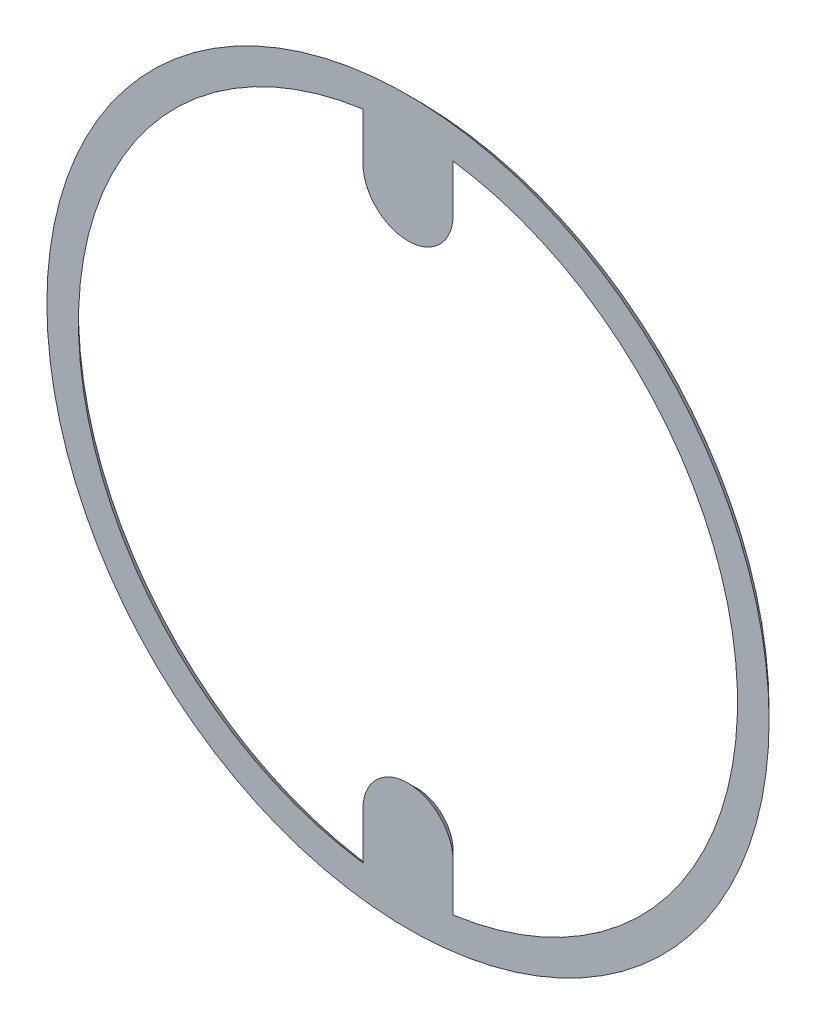
ISO-10303-21;
HEADER;
FILE_DESCRIPTION(('STEP AP214'),'2;1');
FILE_NAME('part.step','',(''),(''),'','','');
FILE_SCHEMA(('AUTOMOTIVE_DESIGN { 1 0 10303 214 1 1 1 1 }'));
ENDSEC;
DATA;
#1=APPLICATION_CONTEXT('core data for automotive mechanical design processes');
#2=APPLICATION_PROTOCOL_DEFINITION('international standard','automotive_design',2000,#1);
#3=PRODUCT_CONTEXT('',#1,'mechanical');
#4=PRODUCT('Part','Part','',(#3));
#5=PRODUCT_RELATED_PRODUCT_CATEGORY('part','',(#4));
#6=PRODUCT_DEFINITION_FORMATION('','',#4);
#7=PRODUCT_DEFINITION_CONTEXT('part definition',#1,'design');
#8=PRODUCT_DEFINITION('design','',#6,#7);
#9=PRODUCT_DEFINITION_SHAPE('','',#8);
#10=(LENGTH_UNIT() NAMED_UNIT(*) SI_UNIT(.MILLI.,.METRE.));
#11=(NAMED_UNIT(*) PLANE_ANGLE_UNIT() SI_UNIT($,.RADIAN.));
#12=(NAMED_UNIT(*) SI_UNIT($,.STERADIAN.) SOLID_ANGLE_UNIT());
#13=UNCERTAINTY_MEASURE_WITH_UNIT(LENGTH_MEASURE(1.E-05),#10,'distance_accuracy_value','');
#14=(GEOMETRIC_REPRESENTATION_CONTEXT(3) GLOBAL_UNCERTAINTY_ASSIGNED_CONTEXT((#13)) GLOBAL_UNIT_ASSIGNED_CONTEXT((#10,
#11,#12)) REPRESENTATION_CONTEXT('',''));
#15=CARTESIAN_POINT('',(0.,0.,0.));
#16=DIRECTION('',(0.,0.,1.));
#17=DIRECTION('',(1.,0.,0.));
#18=AXIS2_PLACEMENT_3D('',#15,#16,#17);
#19=CARTESIAN_POINT('',(56.000092772734,78.000046376367,3.699999952316));
#20=DIRECTION('',(0.,0.,-1.));
#21=DIRECTION('',(-1.,0.,0.));
#22=AXIS2_PLACEMENT_3D('',#19,#20,#21);
#23=PLANE('',#22);
#24=CARTESIAN_POINT('',(56.000092772734,78.000046376367,3.69999995228909));
#25=DIRECTION('',(0.,0.,1.));
#26=DIRECTION('',(1.,0.,0.));
#27=AXIS2_PLACEMENT_3D('',#24,#25,#26);
#28=CIRCLE('',#27,3.89999999993758);
#29=CARTESIAN_POINT('',(59.9000927726716,78.000046376367,3.69999995228909));
#30=VERTEX_POINT('',#29);
#31=EDGE_CURVE('E107',#30,#30,#28,.T.);
#32=ORIENTED_EDGE('',*,*,#31,.F.);
#33=EDGE_LOOP('',(#32));
#34=FACE_BOUND('',#33,.T.);
#35=CARTESIAN_POINT('',(56.000092772734,78.000046376367,3.69999995228908));
#36=DIRECTION('',(0.,0.,-1.));
#37=DIRECTION('',(-1.,0.,0.));
#38=AXIS2_PLACEMENT_3D('',#35,#36,#37);
#39=CIRCLE('',#38,3.75000000003208);
#40=CARTESIAN_POINT('',(56.4000928171839,74.2714407436192,3.69999995230275));
#41=VERTEX_POINT('',#40);
#42=CARTESIAN_POINT('',(56.4000927301314,81.7286520165374,3.69999995417658));
#43=VERTEX_POINT('',#42);
#44=EDGE_CURVE('E127',#41,#43,#39,.F.);
#45=ORIENTED_EDGE('',*,*,#44,.T.);
#46=DIRECTION('',(-5.96244031924794E-09,1.,5.96244031924794E-09));
#47=VECTOR('',#46,1.);
#48=CARTESIAN_POINT('',(56.4000927542505,78.00004638233,3.69999993383249));
#49=LINE('',#48,#47);
#50=CARTESIAN_POINT('',(56.4000927357452,81.1000463799445,3.69999995228909));
#51=VERTEX_POINT('',#50);
#52=EDGE_CURVE('E125',#51,#43,#49,.T.);
#53=ORIENTED_EDGE('',*,*,#52,.F.);
#54=CARTESIAN_POINT('',(56.000092735767,81.100046376367,3.69999995228909));
#55=DIRECTION('',(0.,0.,1.));
#56=DIRECTION('',(1.,0.,0.));
#57=AXIS2_PLACEMENT_3D('',#54,#55,#56);
#58=CIRCLE('',#57,0.39999999994586);
#59=CARTESIAN_POINT('',(55.6000927339082,81.1000463715974,3.69999995418493));
#60=VERTEX_POINT('',#59);
#61=EDGE_CURVE('E115',#60,#51,#58,.T.);
#62=ORIENTED_EDGE('',*,*,#61,.F.);
#63=DIRECTION('',(-5.96244031924794E-09,1.,-5.96244031924794E-09));
#64=VECTOR('',#63,1.);
#65=CARTESIAN_POINT('',(55.6000927505025,78.000046370405,3.6999999745475));
#66=LINE('',#65,#64);
#67=CARTESIAN_POINT('',(55.6000927282843,81.7286520091153,3.6999999523025));
#68=VERTEX_POINT('',#67);
#69=EDGE_CURVE('E93',#68,#60,#66,.F.);
#70=ORIENTED_EDGE('',*,*,#69,.F.);
#71=CARTESIAN_POINT('',(56.000092772734,78.000046376367,3.69999995228909));
#72=DIRECTION('',(0.,0.,-1.));
#73=DIRECTION('',(-1.,0.,0.));
#74=AXIS2_PLACEMENT_3D('',#71,#72,#73);
#75=CIRCLE('',#74,3.75000000003207);
#76=CARTESIAN_POINT('',(55.6000928153368,74.2714407361971,3.69999995417634));
#77=VERTEX_POINT('',#76);
#78=EDGE_CURVE('E90',#68,#77,#75,.F.);
#79=ORIENTED_EDGE('',*,*,#78,.T.);
#80=DIRECTION('',(-5.96244031924794E-09,1.,-5.96244031924794E-09));
#81=VECTOR('',#80,1.);
#82=CARTESIAN_POINT('',(55.600092791218,78.000046370405,3.699999933832));
#83=LINE('',#82,#81);
#84=CARTESIAN_POINT('',(55.6000928097148,74.9000463727895,3.6999999522815));
#85=VERTEX_POINT('',#84);
#86=EDGE_CURVE('E130',#85,#77,#83,.F.);
#87=ORIENTED_EDGE('',*,*,#86,.F.);
#88=CARTESIAN_POINT('',(56.000092809702,74.900046376367,3.69999995228909));
#89=DIRECTION('',(0.,0.,1.));
#90=DIRECTION('',(1.,0.,0.));
#91=AXIS2_PLACEMENT_3D('',#88,#89,#90);
#92=CIRCLE('',#91,0.399999999981152);
#93=CARTESIAN_POINT('',(56.4000928115619,74.900046381137,3.69999995417676));
#94=VERTEX_POINT('',#93);
#95=EDGE_CURVE('E124',#94,#85,#92,.T.);
#96=ORIENTED_EDGE('',*,*,#95,.F.);
#97=DIRECTION('',(-5.96244031924794E-09,1.,5.96244031924794E-09));
#98=VECTOR('',#97,1.);
#99=CARTESIAN_POINT('',(56.400092794966,78.00004638233,3.699999974548));
#100=LINE('',#99,#98);
#101=EDGE_CURVE('E121',#41,#94,#100,.T.);
#102=ORIENTED_EDGE('',*,*,#101,.F.);
#103=EDGE_LOOP('',(#45,#53,#62,#70,#79,#87,#96,#102));
#104=FACE_BOUND('',#103,.T.);
#105=ADVANCED_FACE('F17',(#34,#104),#23,.T.);
#106=CARTESIAN_POINT('',(55.500092772734,78.000046370405,3.799999952316));
#107=DIRECTION('',(-0.707106781186548,-8.4321639643206E-09,-0.707106781186547));
#108=DIRECTION('',(-0.707106781186547,0.,0.707106781186548));
#109=AXIS2_PLACEMENT_3D('',#106,#107,#108);
#110=PLANE('',#109);
#111=ORIENTED_EDGE('',*,*,#69,.T.);
#112=DIRECTION('',(0.707106781186231,8.4315532254713E-09,-0.707106781186864));
#113=VECTOR('',#112,1.);
#114=CARTESIAN_POINT('',(-498940.699906865,81.0940963312715,499000.));
#115=LINE('',#114,#113);
#116=CARTESIAN_POINT('',(55.5000927357729,81.100046373386,3.79999995232083));
#117=VERTEX_POINT('',#116);
#118=EDGE_CURVE('E106',#117,#60,#115,.T.);
#119=ORIENTED_EDGE('',*,*,#118,.F.);
#120=DIRECTION('',(0.,1.,0.));
#121=VECTOR('',#120,1.);
#122=CARTESIAN_POINT('',(55.500092735767,78.000046376367,3.799999952316));
#123=LINE('',#122,#121);
#124=CARTESIAN_POINT('',(55.5000927326915,81.6156376087893,3.79999995231962));
#125=VERTEX_POINT('',#124);
#126=EDGE_CURVE('E98',#117,#125,#123,.T.);
#127=ORIENTED_EDGE('',*,*,#126,.T.);
#128=CARTESIAN_POINT('',(55.5000927296161,81.6156376083652,3.79999995231841));
#129=CARTESIAN_POINT('',(55.5166594475783,81.6346502284434,3.78343323412953));
#130=CARTESIAN_POINT('',(55.5332761413765,81.6535744069867,3.76681654010558));
#131=CARTESIAN_POINT('',(55.5666094743026,81.6912458738354,3.73348320673031));
#132=CARTESIAN_POINT('',(55.5833261133923,81.709993162208,3.71676656741703));
#133=CARTESIAN_POINT('',(55.6000927282801,81.728652009113,3.69999995230672));
#134=B_SPLINE_CURVE_WITH_KNOTS('',3,(#128,#129,#130,#131,#132,#133),.UNSPECIFIED.,.F.,.F.,(4,2,
4),(0.,0.0905161979951703,0.181032361542956),.UNSPECIFIED.);
#135=EDGE_CURVE('E20',#125,#68,#134,.T.);
#136=ORIENTED_EDGE('',*,*,#135,.T.);
#137=EDGE_LOOP('',(#111,#119,#127,#136));
#138=FACE_BOUND('',#137,.T.);
#139=ADVANCED_FACE('F104',(#138),#110,.T.);
#140=CARTESIAN_POINT('',(56.000092772734,78.000046376367,3.69999995240278));
#141=DIRECTION('',(0.,0.,-1.));
#142=DIRECTION('',(-1.,0.,0.));
#143=AXIS2_PLACEMENT_3D('',#140,#141,#142);
#144=CONICAL_SURFACE('',#143,3.74999999991839,0.785398163397448);
#145=CARTESIAN_POINT('',(55.6000928147935,74.2714407367667,3.69999995471964));
#146=CARTESIAN_POINT('',(55.5833261998676,74.2900995828326,3.71676656942304));
#147=CARTESIAN_POINT('',(55.5666095607354,74.308846870363,3.73348320833176));
#148=CARTESIAN_POINT('',(55.5332762277153,74.3465183355214,3.76681654090262));
#149=CARTESIAN_POINT('',(55.5166595338655,74.3654425132165,3.78343323452672));
#150=CARTESIAN_POINT('',(55.5000928158474,74.3844551324436,3.7999999523181));
#151=B_SPLINE_CURVE_WITH_KNOTS('',3,(#145,#146,#147,#148,#149,#150),.UNSPECIFIED.,.F.,.F.,(4,2,
4),(0.,0.090516161376299,0.181032357199962),.UNSPECIFIED.);
#152=CARTESIAN_POINT('',(55.5000928158487,74.3844551324448,3.79999995231947));
#153=VERTEX_POINT('',#152);
#154=EDGE_CURVE('E131',#77,#153,#151,.T.);
#155=ORIENTED_EDGE('',*,*,#154,.F.);
#156=ORIENTED_EDGE('',*,*,#78,.F.);
#157=ORIENTED_EDGE('',*,*,#135,.F.);
#158=CARTESIAN_POINT('',(56.000092772734,78.000046376367,3.79999995232084));
#159=DIRECTION('',(0.,0.,-1.));
#160=DIRECTION('',(-1.,0.,0.));
#161=AXIS2_PLACEMENT_3D('',#158,#159,#160);
#162=CIRCLE('',#161,3.65000000000033);
#163=EDGE_CURVE('E88',#125,#153,#162,.F.);
#164=ORIENTED_EDGE('',*,*,#163,.T.);
#165=EDGE_LOOP('',(#155,#156,#157,#164));
#166=FACE_BOUND('',#165,.T.);
#167=ADVANCED_FACE('F87',(#166),#144,.F.);
#168=CARTESIAN_POINT('',(55.500092772734,78.000046370405,3.799999952316));
#169=DIRECTION('',(-0.707106781186548,-8.4321639643206E-09,-0.707106781186547));
#170=DIRECTION('',(-0.707106781186547,0.,0.707106781186548));
#171=AXIS2_PLACEMENT_3D('',#168,#169,#170);
#172=PLANE('',#171);
#173=ORIENTED_EDGE('',*,*,#86,.T.);
#174=ORIENTED_EDGE('',*,*,#154,.T.);
#175=DIRECTION('',(0.,1.,0.));
#176=VECTOR('',#175,1.);
#177=CARTESIAN_POINT('',(55.50009281585,78.000046376367,3.799999952316));
#178=LINE('',#177,#176);
#179=CARTESIAN_POINT('',(55.5000928127251,74.9000463733857,3.79999995235296));
#180=VERTEX_POINT('',#179);
#181=EDGE_CURVE('E102',#153,#180,#178,.T.);
#182=ORIENTED_EDGE('',*,*,#181,.T.);
#183=DIRECTION('',(0.707106781186231,8.43224783437502E-09,-0.707106781186864));
#184=VECTOR('',#183,1.);
#185=CARTESIAN_POINT('',(-498940.699906791,74.8940958410944,499000.));
#186=LINE('',#185,#184);
#187=EDGE_CURVE('E122',#85,#180,#186,.F.);
#188=ORIENTED_EDGE('',*,*,#187,.F.);
#189=EDGE_LOOP('',(#173,#174,#182,#188));
#190=FACE_BOUND('',#189,.T.);
#191=ADVANCED_FACE('F175',(#190),#172,.T.);
#192=CARTESIAN_POINT('',(56.000092809702,74.900046376367,3.79999995232083));
#193=DIRECTION('',(0.,0.,1.));
#194=DIRECTION('',(1.,0.,0.));
#195=AXIS2_PLACEMENT_3D('',#192,#193,#194);
#196=CONICAL_SURFACE('',#195,0.500000000012893,0.785398163397448);
#197=ORIENTED_EDGE('',*,*,#95,.T.);
#198=ORIENTED_EDGE('',*,*,#187,.T.);
#199=CARTESIAN_POINT('',(56.000092809702,74.900046376367,3.79999995235296));
#200=DIRECTION('',(0.,0.,1.));
#201=DIRECTION('',(1.,0.,0.));
#202=AXIS2_PLACEMENT_3D('',#199,#200,#201);
#203=CIRCLE('',#202,0.50000000004502);
#204=CARTESIAN_POINT('',(56.5000928097019,74.900046378752,3.79999995233459));
#205=VERTEX_POINT('',#204);
#206=EDGE_CURVE('E139',#180,#205,#203,.F.);
#207=ORIENTED_EDGE('',*,*,#206,.T.);
#208=DIRECTION('',(-0.707106781186547,0.,-0.707106781186548));
#209=VECTOR('',#208,1.);
#210=CARTESIAN_POINT('',(56.5000927912176,74.900046381137,3.79999993383244));
#211=LINE('',#210,#209);
#212=EDGE_CURVE('E118',#94,#205,#211,.F.);
#213=ORIENTED_EDGE('',*,*,#212,.F.);
#214=EDGE_LOOP('',(#197,#198,#207,#213));
#215=FACE_BOUND('',#214,.T.);
#216=ADVANCED_FACE('F218',(#215),#196,.T.);
#217=CARTESIAN_POINT('',(56.500092772734,78.00004638233,3.799999952316));
#218=DIRECTION('',(0.707106781186548,8.4321639643206E-09,-0.707106781186547));
#219=DIRECTION('',(-0.707106781186547,0.,-0.707106781186548));
#220=AXIS2_PLACEMENT_3D('',#217,#218,#219);
#221=PLANE('',#220);
#222=ORIENTED_EDGE('',*,*,#101,.T.);
#223=ORIENTED_EDGE('',*,*,#212,.T.);
#224=DIRECTION('',(0.,1.,0.));
#225=VECTOR('',#224,1.);
#226=CARTESIAN_POINT('',(56.500092809702,78.000046376367,3.799999952316));
#227=LINE('',#226,#225);
#228=CARTESIAN_POINT('',(56.5000928127771,74.384455143945,3.79999995231979));
#229=VERTEX_POINT('',#228);
#230=EDGE_CURVE('E138',#205,#229,#227,.F.);
#231=ORIENTED_EDGE('',*,*,#230,.T.);
#232=CARTESIAN_POINT('',(56.5000928158522,74.3844551443692,3.79999995231875));
#233=CARTESIAN_POINT('',(56.4835260978901,74.365442524291,3.78343323412989));
#234=CARTESIAN_POINT('',(56.4669094040919,74.3465183457477,3.76681654010597));
#235=CARTESIAN_POINT('',(56.4335760711659,74.3088468788991,3.73348320673075));
#236=CARTESIAN_POINT('',(56.4168594320762,74.2900995905265,3.71676656741749));
#237=CARTESIAN_POINT('',(56.4000928171884,74.2714407436215,3.69999995230721));
#238=B_SPLINE_CURVE_WITH_KNOTS('',3,(#232,#233,#234,#235,#236,#237),.UNSPECIFIED.,.F.,.F.,(4,2,
4),(0.,0.0905161979950283,0.181032361542683),.UNSPECIFIED.);
#239=EDGE_CURVE('E120',#229,#41,#238,.T.);
#240=ORIENTED_EDGE('',*,*,#239,.T.);
#241=EDGE_LOOP('',(#222,#223,#231,#240));
#242=FACE_BOUND('',#241,.T.);
#243=ADVANCED_FACE('F158',(#242),#221,.T.);
#244=CARTESIAN_POINT('',(56.000092772734,78.000046376367,3.69999995240278));
#245=DIRECTION('',(0.,0.,-1.));
#246=DIRECTION('',(-1.,0.,0.));
#247=AXIS2_PLACEMENT_3D('',#244,#245,#246);
#248=CONICAL_SURFACE('',#247,3.74999999991839,0.785398163397448);
#249=CARTESIAN_POINT('',(56.4000927306745,81.7286520159673,3.69999995471964));
#250=CARTESIAN_POINT('',(56.4168593456004,81.7099931699014,3.71676656942304));
#251=CARTESIAN_POINT('',(56.4335759847327,81.6912458823709,3.73348320833177));
#252=CARTESIAN_POINT('',(56.4669093177528,81.6535744172126,3.76681654090263));
#253=CARTESIAN_POINT('',(56.4835260116025,81.6346502395175,3.78343323452673));
#254=CARTESIAN_POINT('',(56.5000927296206,81.6156376202904,3.79999995231812));
#255=B_SPLINE_CURVE_WITH_KNOTS('',3,(#249,#250,#251,#252,#253,#254),.UNSPECIFIED.,.F.,.F.,(4,2,
4),(0.,0.0905161613762983,0.181032357199986),.UNSPECIFIED.);
#256=CARTESIAN_POINT('',(56.5000927296198,81.6156376202891,3.79999995231947));
#257=VERTEX_POINT('',#256);
#258=EDGE_CURVE('E117',#43,#257,#255,.T.);
#259=ORIENTED_EDGE('',*,*,#258,.F.);
#260=ORIENTED_EDGE('',*,*,#44,.F.);
#261=ORIENTED_EDGE('',*,*,#239,.F.);
#262=CARTESIAN_POINT('',(56.000092772734,78.000046376367,3.79999995232083));
#263=DIRECTION('',(0.,0.,-1.));
#264=DIRECTION('',(-1.,0.,0.));
#265=AXIS2_PLACEMENT_3D('',#262,#263,#264);
#266=CIRCLE('',#265,3.65000000000034);
#267=EDGE_CURVE('E135',#229,#257,#266,.F.);
#268=ORIENTED_EDGE('',*,*,#267,.T.);
#269=EDGE_LOOP('',(#259,#260,#261,#268));
#270=FACE_BOUND('',#269,.T.);
#271=ADVANCED_FACE('F154',(#270),#248,.F.);
#272=CARTESIAN_POINT('',(56.500092772734,78.00004638233,3.799999952316));
#273=DIRECTION('',(0.707106781186548,8.4321639643206E-09,-0.707106781186547));
#274=DIRECTION('',(-0.707106781186547,0.,-0.707106781186548));
#275=AXIS2_PLACEMENT_3D('',#272,#273,#274);
#276=PLANE('',#275);
#277=ORIENTED_EDGE('',*,*,#52,.T.);
#278=ORIENTED_EDGE('',*,*,#258,.T.);
#279=DIRECTION('',(0.,1.,0.));
#280=VECTOR('',#279,1.);
#281=CARTESIAN_POINT('',(56.500092729619,78.000046376367,3.799999952316));
#282=LINE('',#281,#280);
#283=CARTESIAN_POINT('',(56.5000927326871,81.1000463793483,3.79999995232083));
#284=VERTEX_POINT('',#283);
#285=EDGE_CURVE('E134',#257,#284,#282,.F.);
#286=ORIENTED_EDGE('',*,*,#285,.T.);
#287=DIRECTION('',(-0.707106781186231,-8.43224776396138E-09,-0.707106781186864));
#288=VECTOR('',#287,1.);
#289=CARTESIAN_POINT('',(499052.700092336,81.1059969115899,499000.));
#290=LINE('',#289,#288);
#291=EDGE_CURVE('E40',#51,#284,#290,.F.);
#292=ORIENTED_EDGE('',*,*,#291,.F.);
#293=EDGE_LOOP('',(#277,#278,#286,#292));
#294=FACE_BOUND('',#293,.T.);
#295=ADVANCED_FACE('F151',(#294),#276,.T.);
#296=CARTESIAN_POINT('',(56.000092735767,81.100046376367,3.79999995232083));
#297=DIRECTION('',(0.,0.,1.));
#298=DIRECTION('',(1.,0.,0.));
#299=AXIS2_PLACEMENT_3D('',#296,#297,#298);
#300=CONICAL_SURFACE('',#299,0.499999999977602,0.785398163397448);
#301=ORIENTED_EDGE('',*,*,#61,.T.);
#302=ORIENTED_EDGE('',*,*,#291,.T.);
#303=CARTESIAN_POINT('',(56.000092735767,81.100046376367,3.79999995232083));
#304=DIRECTION('',(0.,0.,1.));
#305=DIRECTION('',(1.,0.,0.));
#306=AXIS2_PLACEMENT_3D('',#303,#304,#305);
#307=CIRCLE('',#306,0.499999999977602);
#308=EDGE_CURVE('E31',#284,#117,#307,.F.);
#309=ORIENTED_EDGE('',*,*,#308,.T.);
#310=ORIENTED_EDGE('',*,*,#118,.T.);
#311=EDGE_LOOP('',(#301,#302,#309,#310));
#312=FACE_BOUND('',#311,.T.);
#313=ADVANCED_FACE('F194',(#312),#300,.T.);
#314=CARTESIAN_POINT('',(56.000092772734,78.000046376367,3.79999995226399));
#315=DIRECTION('',(0.,0.,1.));
#316=DIRECTION('',(1.,0.,0.));
#317=AXIS2_PLACEMENT_3D('',#314,#315,#316);
#318=CONICAL_SURFACE('',#317,3.99999999991248,0.78539816339745);
#319=CARTESIAN_POINT('',(56.000092772734,78.000046376367,3.79999995231377));
#320=DIRECTION('',(0.,0.,1.));
#321=DIRECTION('',(1.,0.,0.));
#322=AXIS2_PLACEMENT_3D('',#319,#320,#321);
#323=CIRCLE('',#322,3.99999999996226);
#324=CARTESIAN_POINT('',(60.0000927726963,78.000046376367,3.79999995231377));
#325=VERTEX_POINT('',#324);
#326=EDGE_CURVE('E11',#325,#325,#323,.F.);
#327=ORIENTED_EDGE('',*,*,#326,.T.);
#328=EDGE_LOOP('',(#327));
#329=FACE_BOUND('',#328,.T.);
#330=ORIENTED_EDGE('',*,*,#31,.T.);
#331=EDGE_LOOP('',(#330));
#332=FACE_BOUND('',#331,.T.);
#333=ADVANCED_FACE('F188',(#329,#332),#318,.T.);
#334=CARTESIAN_POINT('',(56.000092772734,78.000046376367,3.799999952316));
#335=DIRECTION('',(0.,0.,-1.));
#336=DIRECTION('',(-1.,0.,0.));
#337=AXIS2_PLACEMENT_3D('',#334,#335,#336);
#338=PLANE('',#337);
#339=ORIENTED_EDGE('',*,*,#326,.F.);
#340=EDGE_LOOP('',(#339));
#341=FACE_BOUND('',#340,.T.);
#342=ORIENTED_EDGE('',*,*,#285,.F.);
#343=ORIENTED_EDGE('',*,*,#267,.F.);
#344=ORIENTED_EDGE('',*,*,#230,.F.);
#345=ORIENTED_EDGE('',*,*,#206,.F.);
#346=ORIENTED_EDGE('',*,*,#181,.F.);
#347=ORIENTED_EDGE('',*,*,#163,.F.);
#348=ORIENTED_EDGE('',*,*,#126,.F.);
#349=ORIENTED_EDGE('',*,*,#308,.F.);
#350=EDGE_LOOP('',(#342,#343,#344,#345,#346,#347,#348,#349));
#351=FACE_BOUND('',#350,.T.);
#352=ADVANCED_FACE('F97',(#341,#351),#338,.F.);
#353=CLOSED_SHELL('',(#105,#139,#167,#191,#216,#243,#271,#295,#313,#333,#352));
#354=MANIFOLD_SOLID_BREP('B1',#353);
#355=ADVANCED_BREP_SHAPE_REPRESENTATION('',(#18,#354),#14);
#356=SHAPE_DEFINITION_REPRESENTATION(#9,#355);
ENDSEC;
END-ISO-10303-21;
